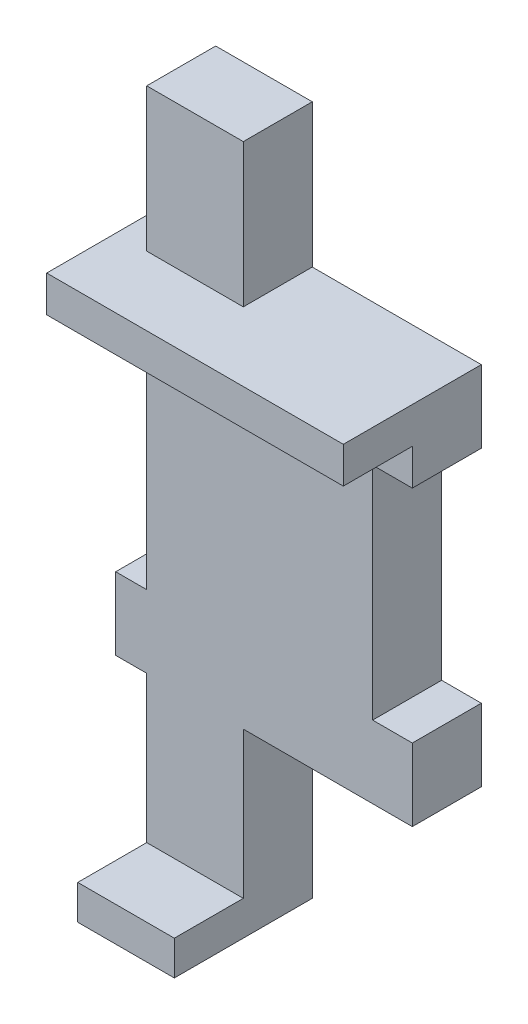
ISO-10303-21;
HEADER;
FILE_DESCRIPTION(('STEP AP214'),'2;1');
FILE_NAME('part.step','',(''),(''),'','','');
FILE_SCHEMA(('AUTOMOTIVE_DESIGN { 1 0 10303 214 1 1 1 1 }'));
ENDSEC;
DATA;
#1=APPLICATION_CONTEXT('core data for automotive mechanical design processes');
#2=APPLICATION_PROTOCOL_DEFINITION('international standard','automotive_design',2000,#1);
#3=PRODUCT_CONTEXT('',#1,'mechanical');
#4=PRODUCT('Part','Part','',(#3));
#5=PRODUCT_RELATED_PRODUCT_CATEGORY('part','',(#4));
#6=PRODUCT_DEFINITION_FORMATION('','',#4);
#7=PRODUCT_DEFINITION_CONTEXT('part definition',#1,'design');
#8=PRODUCT_DEFINITION('design','',#6,#7);
#9=PRODUCT_DEFINITION_SHAPE('','',#8);
#10=(LENGTH_UNIT() NAMED_UNIT(*) SI_UNIT(.MILLI.,.METRE.));
#11=(NAMED_UNIT(*) PLANE_ANGLE_UNIT() SI_UNIT($,.RADIAN.));
#12=(NAMED_UNIT(*) SI_UNIT($,.STERADIAN.) SOLID_ANGLE_UNIT());
#13=UNCERTAINTY_MEASURE_WITH_UNIT(LENGTH_MEASURE(1.E-05),#10,'distance_accuracy_value','');
#14=(GEOMETRIC_REPRESENTATION_CONTEXT(3) GLOBAL_UNCERTAINTY_ASSIGNED_CONTEXT((#13)) GLOBAL_UNIT_ASSIGNED_CONTEXT((#10,
#11,#12)) REPRESENTATION_CONTEXT('',''));
#15=CARTESIAN_POINT('',(0.,0.,0.));
#16=DIRECTION('',(0.,0.,1.));
#17=DIRECTION('',(1.,0.,0.));
#18=AXIS2_PLACEMENT_3D('',#15,#16,#17);
#19=CARTESIAN_POINT('',(0.,0.,4.));
#20=DIRECTION('',(0.,0.,1.));
#21=DIRECTION('',(1.,0.,0.));
#22=AXIS2_PLACEMENT_3D('',#19,#20,#21);
#23=PLANE('',#22);
#24=DIRECTION('',(0.,-1.,0.));
#25=VECTOR('',#24,1.);
#26=CARTESIAN_POINT('',(12.6,11.7,4.));
#27=LINE('',#26,#25);
#28=CARTESIAN_POINT('',(12.6,9.6,4.));
#29=VERTEX_POINT('',#28);
#30=CARTESIAN_POINT('',(12.6,7.5,4.));
#31=VERTEX_POINT('',#30);
#32=EDGE_CURVE('E432',#29,#31,#27,.T.);
#33=ORIENTED_EDGE('',*,*,#32,.F.);
#34=DIRECTION('',(1.,0.,0.));
#35=VECTOR('',#34,1.);
#36=CARTESIAN_POINT('',(-4.6,9.6,4.));
#37=LINE('',#36,#35);
#38=CARTESIAN_POINT('',(-4.6,9.6,4.));
#39=VERTEX_POINT('',#38);
#40=EDGE_CURVE('E521',#39,#29,#37,.T.);
#41=ORIENTED_EDGE('',*,*,#40,.F.);
#42=DIRECTION('',(0.,1.,0.));
#43=VECTOR('',#42,1.);
#44=CARTESIAN_POINT('',(-4.6,11.7,4.));
#45=LINE('',#44,#43);
#46=CARTESIAN_POINT('',(-4.6,7.5,4.));
#47=VERTEX_POINT('',#46);
#48=EDGE_CURVE('E298',#47,#39,#45,.T.);
#49=ORIENTED_EDGE('',*,*,#48,.F.);
#50=DIRECTION('',(1.,0.,0.));
#51=VECTOR('',#50,1.);
#52=CARTESIAN_POINT('',(-4.6,7.5,4.));
#53=LINE('',#52,#51);
#54=CARTESIAN_POINT('',(-2.8,7.5,4.));
#55=VERTEX_POINT('',#54);
#56=EDGE_CURVE('E315',#47,#55,#53,.T.);
#57=ORIENTED_EDGE('',*,*,#56,.T.);
#58=DIRECTION('',(0.,1.,0.));
#59=VECTOR('',#58,1.);
#60=CARTESIAN_POINT('',(-2.8,-20.,4.));
#61=LINE('',#60,#59);
#62=CARTESIAN_POINT('',(-2.8,-5.3,4.));
#63=VERTEX_POINT('',#62);
#64=EDGE_CURVE('E365',#63,#55,#61,.T.);
#65=ORIENTED_EDGE('',*,*,#64,.F.);
#66=DIRECTION('',(1.,0.,0.));
#67=VECTOR('',#66,1.);
#68=CARTESIAN_POINT('',(-4.6,-5.3,4.));
#69=LINE('',#68,#67);
#70=CARTESIAN_POINT('',(-4.6,-5.3,4.));
#71=VERTEX_POINT('',#70);
#72=EDGE_CURVE('E267',#71,#63,#69,.T.);
#73=ORIENTED_EDGE('',*,*,#72,.F.);
#74=DIRECTION('',(0.,-1.,0.));
#75=VECTOR('',#74,1.);
#76=CARTESIAN_POINT('',(-4.6,-9.5,4.));
#77=LINE('',#76,#75);
#78=CARTESIAN_POINT('',(-4.6,-9.5,4.));
#79=VERTEX_POINT('',#78);
#80=EDGE_CURVE('E252',#71,#79,#77,.T.);
#81=ORIENTED_EDGE('',*,*,#80,.T.);
#82=DIRECTION('',(1.,0.,0.));
#83=VECTOR('',#82,1.);
#84=CARTESIAN_POINT('',(-4.6,-9.5,4.));
#85=LINE('',#84,#83);
#86=CARTESIAN_POINT('',(-2.8,-9.5,4.));
#87=VERTEX_POINT('',#86);
#88=EDGE_CURVE('E270',#79,#87,#85,.T.);
#89=ORIENTED_EDGE('',*,*,#88,.T.);
#90=CARTESIAN_POINT('',(-2.8,-18.,4.));
#91=VERTEX_POINT('',#90);
#92=EDGE_CURVE('E360',#91,#87,#61,.T.);
#93=ORIENTED_EDGE('',*,*,#92,.F.);
#94=DIRECTION('',(-1.,0.,0.));
#95=VECTOR('',#94,1.);
#96=CARTESIAN_POINT('',(-2.8,-18.,4.));
#97=LINE('',#96,#95);
#98=CARTESIAN_POINT('',(2.8,-18.,4.));
#99=VERTEX_POINT('',#98);
#100=EDGE_CURVE('E323',#99,#91,#97,.T.);
#101=ORIENTED_EDGE('',*,*,#100,.F.);
#102=DIRECTION('',(0.,1.,0.));
#103=VECTOR('',#102,1.);
#104=CARTESIAN_POINT('',(2.8,-20.,4.));
#105=LINE('',#104,#103);
#106=CARTESIAN_POINT('',(2.8,-9.5,4.));
#107=VERTEX_POINT('',#106);
#108=EDGE_CURVE('E350',#99,#107,#105,.T.);
#109=ORIENTED_EDGE('',*,*,#108,.T.);
#110=DIRECTION('',(-1.,0.,0.));
#111=VECTOR('',#110,1.);
#112=CARTESIAN_POINT('',(4.6,-9.5,4.));
#113=LINE('',#112,#111);
#114=CARTESIAN_POINT('',(12.6,-9.5,4.));
#115=VERTEX_POINT('',#114);
#116=EDGE_CURVE('E240',#115,#107,#113,.T.);
#117=ORIENTED_EDGE('',*,*,#116,.F.);
#118=DIRECTION('',(0.,-1.,0.));
#119=VECTOR('',#118,1.);
#120=CARTESIAN_POINT('',(12.6,-5.3,4.));
#121=LINE('',#120,#119);
#122=CARTESIAN_POINT('',(12.6,-5.3,4.));
#123=VERTEX_POINT('',#122);
#124=EDGE_CURVE('E446',#123,#115,#121,.T.);
#125=ORIENTED_EDGE('',*,*,#124,.F.);
#126=DIRECTION('',(-1.,0.,0.));
#127=VECTOR('',#126,1.);
#128=CARTESIAN_POINT('',(4.6,-5.3,4.));
#129=LINE('',#128,#127);
#130=CARTESIAN_POINT('',(10.3,-5.3,4.));
#131=VERTEX_POINT('',#130);
#132=EDGE_CURVE('E233',#123,#131,#129,.T.);
#133=ORIENTED_EDGE('',*,*,#132,.T.);
#134=DIRECTION('',(0.,-1.,0.));
#135=VECTOR('',#134,1.);
#136=CARTESIAN_POINT('',(10.3,7.5,4.));
#137=LINE('',#136,#135);
#138=CARTESIAN_POINT('',(10.3,7.5,4.));
#139=VERTEX_POINT('',#138);
#140=EDGE_CURVE('E61',#139,#131,#137,.T.);
#141=ORIENTED_EDGE('',*,*,#140,.F.);
#142=DIRECTION('',(-1.,0.,0.));
#143=VECTOR('',#142,1.);
#144=CARTESIAN_POINT('',(4.6,7.5,4.));
#145=LINE('',#144,#143);
#146=EDGE_CURVE('E282',#31,#139,#145,.T.);
#147=ORIENTED_EDGE('',*,*,#146,.F.);
#148=EDGE_LOOP('',(#33,#41,#49,#57,#65,#73,#81,#89,#93,#101,#109,#117,#125,#133,#141,#147));
#149=FACE_BOUND('',#148,.T.);
#150=ADVANCED_FACE('F45',(#149),#23,.T.);
#151=CARTESIAN_POINT('',(-2.8,11.7,4.));
#152=VERTEX_POINT('',#151);
#153=CARTESIAN_POINT('',(-2.8,20.,4.));
#154=VERTEX_POINT('',#153);
#155=EDGE_CURVE('E359',#152,#154,#61,.T.);
#156=ORIENTED_EDGE('',*,*,#155,.F.);
#157=DIRECTION('',(-1.,0.,0.));
#158=VECTOR('',#157,1.);
#159=CARTESIAN_POINT('',(-4.6,11.7,4.));
#160=LINE('',#159,#158);
#161=CARTESIAN_POINT('',(2.8,11.7,4.));
#162=VERTEX_POINT('',#161);
#163=EDGE_CURVE('E408',#162,#152,#160,.T.);
#164=ORIENTED_EDGE('',*,*,#163,.F.);
#165=CARTESIAN_POINT('',(2.8,20.,4.));
#166=VERTEX_POINT('',#165);
#167=EDGE_CURVE('E355',#162,#166,#105,.T.);
#168=ORIENTED_EDGE('',*,*,#167,.T.);
#169=DIRECTION('',(1.,0.,0.));
#170=VECTOR('',#169,1.);
#171=CARTESIAN_POINT('',(-2.8,20.,4.));
#172=LINE('',#171,#170);
#173=EDGE_CURVE('E354',#154,#166,#172,.T.);
#174=ORIENTED_EDGE('',*,*,#173,.F.);
#175=EDGE_LOOP('',(#156,#164,#168,#174));
#176=FACE_BOUND('',#175,.T.);
#177=ADVANCED_FACE('F407',(#176),#23,.T.);
#178=CARTESIAN_POINT('',(2.8,-20.,4.));
#179=DIRECTION('',(-1.,0.,0.));
#180=DIRECTION('',(0.,0.,1.));
#181=AXIS2_PLACEMENT_3D('',#178,#179,#180);
#182=PLANE('',#181);
#183=DIRECTION('',(0.,0.,-1.));
#184=VECTOR('',#183,1.);
#185=CARTESIAN_POINT('',(2.8,-9.5,0.));
#186=LINE('',#185,#184);
#187=CARTESIAN_POINT('',(2.8,-9.5,0.));
#188=VERTEX_POINT('',#187);
#189=EDGE_CURVE('E430',#107,#188,#186,.T.);
#190=ORIENTED_EDGE('',*,*,#189,.F.);
#191=ORIENTED_EDGE('',*,*,#108,.F.);
#192=DIRECTION('',(0.,0.,-1.));
#193=VECTOR('',#192,1.);
#194=CARTESIAN_POINT('',(2.8,-18.,8.));
#195=LINE('',#194,#193);
#196=CARTESIAN_POINT('',(2.8,-18.,8.));
#197=VERTEX_POINT('',#196);
#198=EDGE_CURVE('E345',#197,#99,#195,.T.);
#199=ORIENTED_EDGE('',*,*,#198,.F.);
#200=DIRECTION('',(0.,1.,0.));
#201=VECTOR('',#200,1.);
#202=CARTESIAN_POINT('',(2.8,-20.,8.));
#203=LINE('',#202,#201);
#204=CARTESIAN_POINT('',(2.8,-20.,8.));
#205=VERTEX_POINT('',#204);
#206=EDGE_CURVE('E332',#205,#197,#203,.T.);
#207=ORIENTED_EDGE('',*,*,#206,.F.);
#208=DIRECTION('',(0.,0.,-1.));
#209=VECTOR('',#208,1.);
#210=CARTESIAN_POINT('',(2.8,-20.,4.));
#211=LINE('',#210,#209);
#212=CARTESIAN_POINT('',(2.8,-20.,0.));
#213=VERTEX_POINT('',#212);
#214=EDGE_CURVE('E11',#205,#213,#211,.T.);
#215=ORIENTED_EDGE('',*,*,#214,.T.);
#216=DIRECTION('',(0.,1.,0.));
#217=VECTOR('',#216,1.);
#218=CARTESIAN_POINT('',(2.8,-20.,0.));
#219=LINE('',#218,#217);
#220=EDGE_CURVE('E370',#213,#188,#219,.T.);
#221=ORIENTED_EDGE('',*,*,#220,.T.);
#222=EDGE_LOOP('',(#190,#191,#199,#207,#215,#221));
#223=FACE_BOUND('',#222,.T.);
#224=ADVANCED_FACE('F467',(#223),#182,.F.);
#225=CARTESIAN_POINT('',(-2.8,-20.,4.));
#226=DIRECTION('',(-1.,0.,0.));
#227=DIRECTION('',(0.,0.,1.));
#228=AXIS2_PLACEMENT_3D('',#225,#226,#227);
#229=PLANE('',#228);
#230=DIRECTION('',(0.,0.,-1.));
#231=VECTOR('',#230,1.);
#232=CARTESIAN_POINT('',(-2.8,-9.5,0.));
#233=LINE('',#232,#231);
#234=CARTESIAN_POINT('',(-2.8,-9.5,0.));
#235=VERTEX_POINT('',#234);
#236=EDGE_CURVE('E232',#87,#235,#233,.T.);
#237=ORIENTED_EDGE('',*,*,#236,.T.);
#238=DIRECTION('',(0.,1.,0.));
#239=VECTOR('',#238,1.);
#240=CARTESIAN_POINT('',(-2.8,-20.,0.));
#241=LINE('',#240,#239);
#242=CARTESIAN_POINT('',(-2.8,-20.,0.));
#243=VERTEX_POINT('',#242);
#244=EDGE_CURVE('E378',#243,#235,#241,.T.);
#245=ORIENTED_EDGE('',*,*,#244,.F.);
#246=DIRECTION('',(0.,0.,-1.));
#247=VECTOR('',#246,1.);
#248=CARTESIAN_POINT('',(-2.8,-20.,4.));
#249=LINE('',#248,#247);
#250=CARTESIAN_POINT('',(-2.8,-20.,8.));
#251=VERTEX_POINT('',#250);
#252=EDGE_CURVE('E364',#251,#243,#249,.T.);
#253=ORIENTED_EDGE('',*,*,#252,.F.);
#254=DIRECTION('',(0.,-1.,0.));
#255=VECTOR('',#254,1.);
#256=CARTESIAN_POINT('',(-2.8,-20.,8.));
#257=LINE('',#256,#255);
#258=CARTESIAN_POINT('',(-2.8,-18.,8.));
#259=VERTEX_POINT('',#258);
#260=EDGE_CURVE('E324',#259,#251,#257,.T.);
#261=ORIENTED_EDGE('',*,*,#260,.F.);
#262=DIRECTION('',(0.,0.,-1.));
#263=VECTOR('',#262,1.);
#264=CARTESIAN_POINT('',(-2.8,-18.,8.));
#265=LINE('',#264,#263);
#266=EDGE_CURVE('E338',#259,#91,#265,.T.);
#267=ORIENTED_EDGE('',*,*,#266,.T.);
#268=ORIENTED_EDGE('',*,*,#92,.T.);
#269=EDGE_LOOP('',(#237,#245,#253,#261,#267,#268));
#270=FACE_BOUND('',#269,.T.);
#271=ADVANCED_FACE('F480',(#270),#229,.T.);
#272=DIRECTION('',(0.,0.,-1.));
#273=VECTOR('',#272,1.);
#274=CARTESIAN_POINT('',(-2.8,11.7,0.));
#275=LINE('',#274,#273);
#276=CARTESIAN_POINT('',(-2.8,11.7,0.));
#277=VERTEX_POINT('',#276);
#278=EDGE_CURVE('E295',#152,#277,#275,.T.);
#279=ORIENTED_EDGE('',*,*,#278,.F.);
#280=ORIENTED_EDGE('',*,*,#155,.T.);
#281=DIRECTION('',(0.,0.,-1.));
#282=VECTOR('',#281,1.);
#283=CARTESIAN_POINT('',(-2.8,20.,4.));
#284=LINE('',#283,#282);
#285=CARTESIAN_POINT('',(-2.8,20.,0.));
#286=VERTEX_POINT('',#285);
#287=EDGE_CURVE('E385',#154,#286,#284,.T.);
#288=ORIENTED_EDGE('',*,*,#287,.T.);
#289=EDGE_CURVE('E377',#277,#286,#241,.T.);
#290=ORIENTED_EDGE('',*,*,#289,.F.);
#291=EDGE_LOOP('',(#279,#280,#288,#290));
#292=FACE_BOUND('',#291,.T.);
#293=ADVANCED_FACE('F404',(#292),#229,.T.);
#294=CARTESIAN_POINT('',(-2.8,-20.,4.));
#295=DIRECTION('',(0.,1.,0.));
#296=DIRECTION('',(0.,0.,1.));
#297=AXIS2_PLACEMENT_3D('',#294,#295,#296);
#298=PLANE('',#297);
#299=DIRECTION('',(1.,0.,0.));
#300=VECTOR('',#299,1.);
#301=CARTESIAN_POINT('',(-2.8,-20.,0.));
#302=LINE('',#301,#300);
#303=EDGE_CURVE('E349',#243,#213,#302,.T.);
#304=ORIENTED_EDGE('',*,*,#303,.T.);
#305=ORIENTED_EDGE('',*,*,#214,.F.);
#306=DIRECTION('',(1.,0.,0.));
#307=VECTOR('',#306,1.);
#308=CARTESIAN_POINT('',(-2.8,-20.,8.));
#309=LINE('',#308,#307);
#310=EDGE_CURVE('E328',#251,#205,#309,.T.);
#311=ORIENTED_EDGE('',*,*,#310,.F.);
#312=ORIENTED_EDGE('',*,*,#252,.T.);
#313=EDGE_LOOP('',(#304,#305,#311,#312));
#314=FACE_BOUND('',#313,.T.);
#315=ADVANCED_FACE('F47',(#314),#298,.F.);
#316=ORIENTED_EDGE('',*,*,#167,.F.);
#317=DIRECTION('',(0.,0.,-1.));
#318=VECTOR('',#317,1.);
#319=CARTESIAN_POINT('',(2.8,11.7,0.));
#320=LINE('',#319,#318);
#321=CARTESIAN_POINT('',(2.8,11.7,0.));
#322=VERTEX_POINT('',#321);
#323=EDGE_CURVE('E276',#162,#322,#320,.T.);
#324=ORIENTED_EDGE('',*,*,#323,.T.);
#325=CARTESIAN_POINT('',(2.8,20.,0.));
#326=VERTEX_POINT('',#325);
#327=EDGE_CURVE('E369',#322,#326,#219,.T.);
#328=ORIENTED_EDGE('',*,*,#327,.T.);
#329=DIRECTION('',(0.,0.,-1.));
#330=VECTOR('',#329,1.);
#331=CARTESIAN_POINT('',(2.8,20.,4.));
#332=LINE('',#331,#330);
#333=EDGE_CURVE('E54',#166,#326,#332,.T.);
#334=ORIENTED_EDGE('',*,*,#333,.F.);
#335=EDGE_LOOP('',(#316,#324,#328,#334));
#336=FACE_BOUND('',#335,.T.);
#337=ADVANCED_FACE('F413',(#336),#182,.F.);
#338=CARTESIAN_POINT('',(-2.8,20.,4.));
#339=DIRECTION('',(0.,1.,0.));
#340=DIRECTION('',(0.,0.,1.));
#341=AXIS2_PLACEMENT_3D('',#338,#339,#340);
#342=PLANE('',#341);
#343=DIRECTION('',(1.,0.,0.));
#344=VECTOR('',#343,1.);
#345=CARTESIAN_POINT('',(-2.8,20.,0.));
#346=LINE('',#345,#344);
#347=EDGE_CURVE('E373',#286,#326,#346,.T.);
#348=ORIENTED_EDGE('',*,*,#347,.F.);
#349=ORIENTED_EDGE('',*,*,#287,.F.);
#350=ORIENTED_EDGE('',*,*,#173,.T.);
#351=ORIENTED_EDGE('',*,*,#333,.T.);
#352=EDGE_LOOP('',(#348,#349,#350,#351));
#353=FACE_BOUND('',#352,.T.);
#354=ADVANCED_FACE('F393',(#353),#342,.T.);
#355=DIRECTION('',(0.,0.,1.));
#356=VECTOR('',#355,1.);
#357=CARTESIAN_POINT('',(-2.8,-5.3,0.));
#358=LINE('',#357,#356);
#359=CARTESIAN_POINT('',(-2.8,-5.3,0.));
#360=VERTEX_POINT('',#359);
#361=EDGE_CURVE('E238',#360,#63,#358,.T.);
#362=ORIENTED_EDGE('',*,*,#361,.T.);
#363=ORIENTED_EDGE('',*,*,#64,.T.);
#364=DIRECTION('',(0.,0.,1.));
#365=VECTOR('',#364,1.);
#366=CARTESIAN_POINT('',(-2.8,7.5,0.));
#367=LINE('',#366,#365);
#368=CARTESIAN_POINT('',(-2.8,7.5,0.));
#369=VERTEX_POINT('',#368);
#370=EDGE_CURVE('E289',#369,#55,#367,.T.);
#371=ORIENTED_EDGE('',*,*,#370,.F.);
#372=EDGE_CURVE('E382',#360,#369,#241,.T.);
#373=ORIENTED_EDGE('',*,*,#372,.F.);
#374=EDGE_LOOP('',(#362,#363,#371,#373));
#375=FACE_BOUND('',#374,.T.);
#376=ADVANCED_FACE('F496',(#375),#229,.T.);
#377=CARTESIAN_POINT('',(0.,0.,0.));
#378=DIRECTION('',(0.,0.,1.));
#379=DIRECTION('',(1.,0.,0.));
#380=AXIS2_PLACEMENT_3D('',#377,#378,#379);
#381=PLANE('',#380);
#382=CARTESIAN_POINT('',(4.9,1.1,0.));
#383=DIRECTION('',(0.,0.,-1.));
#384=DIRECTION('',(-1.,0.,0.));
#385=AXIS2_PLACEMENT_3D('',#382,#383,#384);
#386=CIRCLE('',#385,1.5);
#387=CARTESIAN_POINT('',(3.4,1.1,0.));
#388=VERTEX_POINT('',#387);
#389=EDGE_CURVE('E767',#388,#388,#386,.T.);
#390=ORIENTED_EDGE('',*,*,#389,.F.);
#391=EDGE_LOOP('',(#390));
#392=FACE_BOUND('',#391,.T.);
#393=ORIENTED_EDGE('',*,*,#303,.F.);
#394=ORIENTED_EDGE('',*,*,#244,.T.);
#395=DIRECTION('',(1.,0.,0.));
#396=VECTOR('',#395,1.);
#397=CARTESIAN_POINT('',(-4.6,-9.5,0.));
#398=LINE('',#397,#396);
#399=CARTESIAN_POINT('',(-4.6,-9.5,0.));
#400=VERTEX_POINT('',#399);
#401=EDGE_CURVE('E273',#400,#235,#398,.T.);
#402=ORIENTED_EDGE('',*,*,#401,.F.);
#403=DIRECTION('',(0.,1.,0.));
#404=VECTOR('',#403,1.);
#405=CARTESIAN_POINT('',(-4.6,-9.5,0.));
#406=LINE('',#405,#404);
#407=CARTESIAN_POINT('',(-4.6,-5.3,0.));
#408=VERTEX_POINT('',#407);
#409=EDGE_CURVE('E244',#400,#408,#406,.T.);
#410=ORIENTED_EDGE('',*,*,#409,.T.);
#411=DIRECTION('',(1.,0.,0.));
#412=VECTOR('',#411,1.);
#413=CARTESIAN_POINT('',(-4.6,-5.3,0.));
#414=LINE('',#413,#412);
#415=EDGE_CURVE('E259',#408,#360,#414,.T.);
#416=ORIENTED_EDGE('',*,*,#415,.T.);
#417=ORIENTED_EDGE('',*,*,#372,.T.);
#418=DIRECTION('',(1.,0.,0.));
#419=VECTOR('',#418,1.);
#420=CARTESIAN_POINT('',(-4.6,7.5,0.));
#421=LINE('',#420,#419);
#422=CARTESIAN_POINT('',(-4.6,7.5,0.));
#423=VERTEX_POINT('',#422);
#424=EDGE_CURVE('E319',#423,#369,#421,.T.);
#425=ORIENTED_EDGE('',*,*,#424,.F.);
#426=DIRECTION('',(0.,-1.,0.));
#427=VECTOR('',#426,1.);
#428=CARTESIAN_POINT('',(-4.6,11.7,0.));
#429=LINE('',#428,#427);
#430=CARTESIAN_POINT('',(-4.6,11.7,0.));
#431=VERTEX_POINT('',#430);
#432=EDGE_CURVE('E290',#431,#423,#429,.T.);
#433=ORIENTED_EDGE('',*,*,#432,.F.);
#434=DIRECTION('',(1.,0.,0.));
#435=VECTOR('',#434,1.);
#436=CARTESIAN_POINT('',(-4.6,11.7,0.));
#437=LINE('',#436,#435);
#438=EDGE_CURVE('E305',#431,#277,#437,.T.);
#439=ORIENTED_EDGE('',*,*,#438,.T.);
#440=ORIENTED_EDGE('',*,*,#289,.T.);
#441=ORIENTED_EDGE('',*,*,#347,.T.);
#442=ORIENTED_EDGE('',*,*,#327,.F.);
#443=DIRECTION('',(-1.,0.,0.));
#444=VECTOR('',#443,1.);
#445=CARTESIAN_POINT('',(4.6,11.7,0.));
#446=LINE('',#445,#444);
#447=CARTESIAN_POINT('',(12.6,11.7,0.));
#448=VERTEX_POINT('',#447);
#449=EDGE_CURVE('E286',#448,#322,#446,.T.);
#450=ORIENTED_EDGE('',*,*,#449,.F.);
#451=DIRECTION('',(0.,1.,0.));
#452=VECTOR('',#451,1.);
#453=CARTESIAN_POINT('',(12.6,11.7,0.));
#454=LINE('',#453,#452);
#455=CARTESIAN_POINT('',(12.6,7.5,0.));
#456=VERTEX_POINT('',#455);
#457=EDGE_CURVE('E420',#456,#448,#454,.T.);
#458=ORIENTED_EDGE('',*,*,#457,.F.);
#459=DIRECTION('',(-1.,0.,0.));
#460=VECTOR('',#459,1.);
#461=CARTESIAN_POINT('',(4.6,7.5,0.));
#462=LINE('',#461,#460);
#463=CARTESIAN_POINT('',(10.3,7.5,0.));
#464=VERTEX_POINT('',#463);
#465=EDGE_CURVE('E223',#456,#464,#462,.T.);
#466=ORIENTED_EDGE('',*,*,#465,.T.);
#467=DIRECTION('',(0.,1.,0.));
#468=VECTOR('',#467,1.);
#469=CARTESIAN_POINT('',(10.3,7.5,0.));
#470=LINE('',#469,#468);
#471=CARTESIAN_POINT('',(10.3,-5.3,0.));
#472=VERTEX_POINT('',#471);
#473=EDGE_CURVE('E208',#472,#464,#470,.T.);
#474=ORIENTED_EDGE('',*,*,#473,.F.);
#475=DIRECTION('',(-1.,0.,0.));
#476=VECTOR('',#475,1.);
#477=CARTESIAN_POINT('',(4.6,-5.3,0.));
#478=LINE('',#477,#476);
#479=CARTESIAN_POINT('',(12.6,-5.3,0.));
#480=VERTEX_POINT('',#479);
#481=EDGE_CURVE('E220',#480,#472,#478,.T.);
#482=ORIENTED_EDGE('',*,*,#481,.F.);
#483=DIRECTION('',(0.,1.,0.));
#484=VECTOR('',#483,1.);
#485=CARTESIAN_POINT('',(12.6,-5.3,0.));
#486=LINE('',#485,#484);
#487=CARTESIAN_POINT('',(12.6,-9.5,0.));
#488=VERTEX_POINT('',#487);
#489=EDGE_CURVE('E438',#488,#480,#486,.T.);
#490=ORIENTED_EDGE('',*,*,#489,.F.);
#491=DIRECTION('',(-1.,0.,0.));
#492=VECTOR('',#491,1.);
#493=CARTESIAN_POINT('',(4.6,-9.5,0.));
#494=LINE('',#493,#492);
#495=EDGE_CURVE('E453',#488,#188,#494,.T.);
#496=ORIENTED_EDGE('',*,*,#495,.T.);
#497=ORIENTED_EDGE('',*,*,#220,.F.);
#498=EDGE_LOOP('',(#393,#394,#402,#410,#416,#417,#425,#433,#439,#440,#441,#442,#450,#458,#466,
#474,#482,#490,#496,#497));
#499=FACE_BOUND('',#498,.T.);
#500=ADVANCED_FACE('F218',(#392,#499),#381,.F.);
#501=CARTESIAN_POINT('',(-2.8,-18.,8.));
#502=DIRECTION('',(0.,-1.,0.));
#503=DIRECTION('',(0.,0.,-1.));
#504=AXIS2_PLACEMENT_3D('',#501,#502,#503);
#505=PLANE('',#504);
#506=ORIENTED_EDGE('',*,*,#100,.T.);
#507=ORIENTED_EDGE('',*,*,#266,.F.);
#508=DIRECTION('',(-1.,0.,0.));
#509=VECTOR('',#508,1.);
#510=CARTESIAN_POINT('',(-2.8,-18.,8.));
#511=LINE('',#510,#509);
#512=EDGE_CURVE('E335',#197,#259,#511,.T.);
#513=ORIENTED_EDGE('',*,*,#512,.F.);
#514=ORIENTED_EDGE('',*,*,#198,.T.);
#515=EDGE_LOOP('',(#506,#507,#513,#514));
#516=FACE_BOUND('',#515,.T.);
#517=ADVANCED_FACE('F471',(#516),#505,.F.);
#518=CARTESIAN_POINT('',(0.,0.,8.));
#519=DIRECTION('',(0.,0.,-1.));
#520=DIRECTION('',(-1.,0.,0.));
#521=AXIS2_PLACEMENT_3D('',#518,#519,#520);
#522=PLANE('',#521);
#523=ORIENTED_EDGE('',*,*,#260,.T.);
#524=ORIENTED_EDGE('',*,*,#310,.T.);
#525=ORIENTED_EDGE('',*,*,#206,.T.);
#526=ORIENTED_EDGE('',*,*,#512,.T.);
#527=EDGE_LOOP('',(#523,#524,#525,#526));
#528=FACE_BOUND('',#527,.T.);
#529=ADVANCED_FACE('F475',(#528),#522,.F.);
#530=CARTESIAN_POINT('',(-4.6,7.5,0.));
#531=DIRECTION('',(0.,1.,0.));
#532=DIRECTION('',(0.,0.,1.));
#533=AXIS2_PLACEMENT_3D('',#530,#531,#532);
#534=PLANE('',#533);
#535=ORIENTED_EDGE('',*,*,#370,.T.);
#536=ORIENTED_EDGE('',*,*,#56,.F.);
#537=DIRECTION('',(0.,0.,1.));
#538=VECTOR('',#537,1.);
#539=CARTESIAN_POINT('',(-4.6,7.5,0.));
#540=LINE('',#539,#538);
#541=EDGE_CURVE('E294',#423,#47,#540,.T.);
#542=ORIENTED_EDGE('',*,*,#541,.F.);
#543=ORIENTED_EDGE('',*,*,#424,.T.);
#544=EDGE_LOOP('',(#535,#536,#542,#543));
#545=FACE_BOUND('',#544,.T.);
#546=ADVANCED_FACE('F500',(#545),#534,.F.);
#547=CARTESIAN_POINT('',(-4.6,11.7,0.));
#548=DIRECTION('',(0.,-1.,0.));
#549=DIRECTION('',(0.,0.,-1.));
#550=AXIS2_PLACEMENT_3D('',#547,#548,#549);
#551=PLANE('',#550);
#552=ORIENTED_EDGE('',*,*,#278,.T.);
#553=ORIENTED_EDGE('',*,*,#438,.F.);
#554=DIRECTION('',(0.,0.,-1.));
#555=VECTOR('',#554,1.);
#556=CARTESIAN_POINT('',(-4.6,11.7,0.));
#557=LINE('',#556,#555);
#558=CARTESIAN_POINT('',(-4.6,11.7,8.));
#559=VERTEX_POINT('',#558);
#560=EDGE_CURVE('E302',#559,#431,#557,.T.);
#561=ORIENTED_EDGE('',*,*,#560,.F.);
#562=DIRECTION('',(-1.,0.,0.));
#563=VECTOR('',#562,1.);
#564=CARTESIAN_POINT('',(-4.6,11.7,8.));
#565=LINE('',#564,#563);
#566=CARTESIAN_POINT('',(12.6,11.7,8.));
#567=VERTEX_POINT('',#566);
#568=EDGE_CURVE('E508',#567,#559,#565,.T.);
#569=ORIENTED_EDGE('',*,*,#568,.F.);
#570=DIRECTION('',(0.,0.,1.));
#571=VECTOR('',#570,1.);
#572=CARTESIAN_POINT('',(12.6,11.7,4.));
#573=LINE('',#572,#571);
#574=EDGE_CURVE('E418',#448,#567,#573,.T.);
#575=ORIENTED_EDGE('',*,*,#574,.F.);
#576=ORIENTED_EDGE('',*,*,#449,.T.);
#577=ORIENTED_EDGE('',*,*,#323,.F.);
#578=ORIENTED_EDGE('',*,*,#163,.T.);
#579=EDGE_LOOP('',(#552,#553,#561,#569,#575,#576,#577,#578));
#580=FACE_BOUND('',#579,.T.);
#581=ADVANCED_FACE('F415',(#580),#551,.F.);
#582=CARTESIAN_POINT('',(-4.6,0.,0.));
#583=DIRECTION('',(-1.,0.,0.));
#584=DIRECTION('',(0.,0.,1.));
#585=AXIS2_PLACEMENT_3D('',#582,#583,#584);
#586=PLANE('',#585);
#587=ORIENTED_EDGE('',*,*,#432,.T.);
#588=ORIENTED_EDGE('',*,*,#541,.T.);
#589=ORIENTED_EDGE('',*,*,#48,.T.);
#590=DIRECTION('',(0.,0.,-1.));
#591=VECTOR('',#590,1.);
#592=CARTESIAN_POINT('',(-4.6,9.6,8.));
#593=LINE('',#592,#591);
#594=CARTESIAN_POINT('',(-4.6,9.6,8.));
#595=VERTEX_POINT('',#594);
#596=EDGE_CURVE('E439',#595,#39,#593,.T.);
#597=ORIENTED_EDGE('',*,*,#596,.F.);
#598=DIRECTION('',(0.,-1.,0.));
#599=VECTOR('',#598,1.);
#600=CARTESIAN_POINT('',(-4.6,11.7,8.));
#601=LINE('',#600,#599);
#602=EDGE_CURVE('E506',#559,#595,#601,.T.);
#603=ORIENTED_EDGE('',*,*,#602,.F.);
#604=ORIENTED_EDGE('',*,*,#560,.T.);
#605=EDGE_LOOP('',(#587,#588,#589,#597,#603,#604));
#606=FACE_BOUND('',#605,.T.);
#607=ADVANCED_FACE('F502',(#606),#586,.T.);
#608=CARTESIAN_POINT('',(4.6,7.5,0.));
#609=DIRECTION('',(0.,-1.,0.));
#610=DIRECTION('',(0.,0.,-1.));
#611=AXIS2_PLACEMENT_3D('',#608,#609,#610);
#612=PLANE('',#611);
#613=DIRECTION('',(0.,0.,1.));
#614=VECTOR('',#613,1.);
#615=CARTESIAN_POINT('',(10.3,7.5,4.));
#616=LINE('',#615,#614);
#617=EDGE_CURVE('E225',#464,#139,#616,.T.);
#618=ORIENTED_EDGE('',*,*,#617,.F.);
#619=ORIENTED_EDGE('',*,*,#465,.F.);
#620=DIRECTION('',(0.,0.,-1.));
#621=VECTOR('',#620,1.);
#622=CARTESIAN_POINT('',(12.6,7.5,4.));
#623=LINE('',#622,#621);
#624=EDGE_CURVE('E425',#31,#456,#623,.T.);
#625=ORIENTED_EDGE('',*,*,#624,.F.);
#626=ORIENTED_EDGE('',*,*,#146,.T.);
#627=EDGE_LOOP('',(#618,#619,#625,#626));
#628=FACE_BOUND('',#627,.T.);
#629=ADVANCED_FACE('F531',(#628),#612,.T.);
#630=CARTESIAN_POINT('',(-4.6,-9.5,0.));
#631=DIRECTION('',(0.,-1.,0.));
#632=DIRECTION('',(0.,0.,-1.));
#633=AXIS2_PLACEMENT_3D('',#630,#631,#632);
#634=PLANE('',#633);
#635=ORIENTED_EDGE('',*,*,#236,.F.);
#636=ORIENTED_EDGE('',*,*,#88,.F.);
#637=DIRECTION('',(0.,0.,-1.));
#638=VECTOR('',#637,1.);
#639=CARTESIAN_POINT('',(-4.6,-9.5,0.));
#640=LINE('',#639,#638);
#641=EDGE_CURVE('E248',#79,#400,#640,.T.);
#642=ORIENTED_EDGE('',*,*,#641,.T.);
#643=ORIENTED_EDGE('',*,*,#401,.T.);
#644=EDGE_LOOP('',(#635,#636,#642,#643));
#645=FACE_BOUND('',#644,.T.);
#646=ADVANCED_FACE('F483',(#645),#634,.T.);
#647=CARTESIAN_POINT('',(-4.6,-5.3,0.));
#648=DIRECTION('',(0.,1.,0.));
#649=DIRECTION('',(0.,0.,1.));
#650=AXIS2_PLACEMENT_3D('',#647,#648,#649);
#651=PLANE('',#650);
#652=ORIENTED_EDGE('',*,*,#361,.F.);
#653=ORIENTED_EDGE('',*,*,#415,.F.);
#654=DIRECTION('',(0.,0.,1.));
#655=VECTOR('',#654,1.);
#656=CARTESIAN_POINT('',(-4.6,-5.3,0.));
#657=LINE('',#656,#655);
#658=EDGE_CURVE('E256',#408,#71,#657,.T.);
#659=ORIENTED_EDGE('',*,*,#658,.T.);
#660=ORIENTED_EDGE('',*,*,#72,.T.);
#661=EDGE_LOOP('',(#652,#653,#659,#660));
#662=FACE_BOUND('',#661,.T.);
#663=ADVANCED_FACE('F491',(#662),#651,.T.);
#664=CARTESIAN_POINT('',(-4.6,2.2,0.));
#665=DIRECTION('',(-1.,0.,0.));
#666=DIRECTION('',(0.,0.,1.));
#667=AXIS2_PLACEMENT_3D('',#664,#665,#666);
#668=PLANE('',#667);
#669=ORIENTED_EDGE('',*,*,#409,.F.);
#670=ORIENTED_EDGE('',*,*,#641,.F.);
#671=ORIENTED_EDGE('',*,*,#80,.F.);
#672=ORIENTED_EDGE('',*,*,#658,.F.);
#673=EDGE_LOOP('',(#669,#670,#671,#672));
#674=FACE_BOUND('',#673,.T.);
#675=ADVANCED_FACE('F488',(#674),#668,.T.);
#676=CARTESIAN_POINT('',(4.6,-5.3,0.));
#677=DIRECTION('',(0.,-1.,0.));
#678=DIRECTION('',(0.,0.,-1.));
#679=AXIS2_PLACEMENT_3D('',#676,#677,#678);
#680=PLANE('',#679);
#681=ORIENTED_EDGE('',*,*,#481,.T.);
#682=DIRECTION('',(0.,0.,-1.));
#683=VECTOR('',#682,1.);
#684=CARTESIAN_POINT('',(10.3,-5.3,4.));
#685=LINE('',#684,#683);
#686=EDGE_CURVE('E205',#131,#472,#685,.T.);
#687=ORIENTED_EDGE('',*,*,#686,.F.);
#688=ORIENTED_EDGE('',*,*,#132,.F.);
#689=DIRECTION('',(0.,0.,1.));
#690=VECTOR('',#689,1.);
#691=CARTESIAN_POINT('',(12.6,-5.3,4.));
#692=LINE('',#691,#690);
#693=EDGE_CURVE('E230',#480,#123,#692,.T.);
#694=ORIENTED_EDGE('',*,*,#693,.F.);
#695=EDGE_LOOP('',(#681,#687,#688,#694));
#696=FACE_BOUND('',#695,.T.);
#697=ADVANCED_FACE('F228',(#696),#680,.F.);
#698=CARTESIAN_POINT('',(4.6,-9.5,0.));
#699=DIRECTION('',(0.,1.,0.));
#700=DIRECTION('',(0.,0.,1.));
#701=AXIS2_PLACEMENT_3D('',#698,#699,#700);
#702=PLANE('',#701);
#703=ORIENTED_EDGE('',*,*,#189,.T.);
#704=ORIENTED_EDGE('',*,*,#495,.F.);
#705=DIRECTION('',(0.,0.,-1.));
#706=VECTOR('',#705,1.);
#707=CARTESIAN_POINT('',(12.6,-9.5,4.));
#708=LINE('',#707,#706);
#709=EDGE_CURVE('E442',#115,#488,#708,.T.);
#710=ORIENTED_EDGE('',*,*,#709,.F.);
#711=ORIENTED_EDGE('',*,*,#116,.T.);
#712=EDGE_LOOP('',(#703,#704,#710,#711));
#713=FACE_BOUND('',#712,.T.);
#714=ADVANCED_FACE('F460',(#713),#702,.F.);
#715=CARTESIAN_POINT('',(12.6,0.,0.));
#716=DIRECTION('',(1.,0.,0.));
#717=DIRECTION('',(0.,0.,-1.));
#718=AXIS2_PLACEMENT_3D('',#715,#716,#717);
#719=PLANE('',#718);
#720=ORIENTED_EDGE('',*,*,#124,.T.);
#721=ORIENTED_EDGE('',*,*,#709,.T.);
#722=ORIENTED_EDGE('',*,*,#489,.T.);
#723=ORIENTED_EDGE('',*,*,#693,.T.);
#724=EDGE_LOOP('',(#720,#721,#722,#723));
#725=FACE_BOUND('',#724,.T.);
#726=ADVANCED_FACE('F549',(#725),#719,.T.);
#727=CARTESIAN_POINT('',(12.6,0.,0.));
#728=DIRECTION('',(1.,0.,0.));
#729=DIRECTION('',(0.,0.,-1.));
#730=AXIS2_PLACEMENT_3D('',#727,#728,#729);
#731=PLANE('',#730);
#732=ORIENTED_EDGE('',*,*,#574,.T.);
#733=DIRECTION('',(0.,1.,0.));
#734=VECTOR('',#733,1.);
#735=CARTESIAN_POINT('',(12.6,11.7,8.));
#736=LINE('',#735,#734);
#737=CARTESIAN_POINT('',(12.6,9.6,8.));
#738=VERTEX_POINT('',#737);
#739=EDGE_CURVE('E511',#738,#567,#736,.T.);
#740=ORIENTED_EDGE('',*,*,#739,.F.);
#741=DIRECTION('',(0.,0.,-1.));
#742=VECTOR('',#741,1.);
#743=CARTESIAN_POINT('',(12.6,9.6,8.));
#744=LINE('',#743,#742);
#745=EDGE_CURVE('E69',#738,#29,#744,.T.);
#746=ORIENTED_EDGE('',*,*,#745,.T.);
#747=ORIENTED_EDGE('',*,*,#32,.T.);
#748=ORIENTED_EDGE('',*,*,#624,.T.);
#749=ORIENTED_EDGE('',*,*,#457,.T.);
#750=EDGE_LOOP('',(#732,#740,#746,#747,#748,#749));
#751=FACE_BOUND('',#750,.T.);
#752=ADVANCED_FACE('F422',(#751),#731,.T.);
#753=CARTESIAN_POINT('',(-4.6,9.6,8.));
#754=DIRECTION('',(0.,1.,0.));
#755=DIRECTION('',(0.,0.,1.));
#756=AXIS2_PLACEMENT_3D('',#753,#754,#755);
#757=PLANE('',#756);
#758=ORIENTED_EDGE('',*,*,#40,.T.);
#759=ORIENTED_EDGE('',*,*,#745,.F.);
#760=DIRECTION('',(1.,0.,0.));
#761=VECTOR('',#760,1.);
#762=CARTESIAN_POINT('',(-4.6,9.6,8.));
#763=LINE('',#762,#761);
#764=EDGE_CURVE('E517',#595,#738,#763,.T.);
#765=ORIENTED_EDGE('',*,*,#764,.F.);
#766=ORIENTED_EDGE('',*,*,#596,.T.);
#767=EDGE_LOOP('',(#758,#759,#765,#766));
#768=FACE_BOUND('',#767,.T.);
#769=ADVANCED_FACE('F538',(#768),#757,.F.);
#770=CARTESIAN_POINT('',(0.,0.,8.));
#771=DIRECTION('',(0.,0.,1.));
#772=DIRECTION('',(1.,0.,0.));
#773=AXIS2_PLACEMENT_3D('',#770,#771,#772);
#774=PLANE('',#773);
#775=ORIENTED_EDGE('',*,*,#602,.T.);
#776=ORIENTED_EDGE('',*,*,#764,.T.);
#777=ORIENTED_EDGE('',*,*,#739,.T.);
#778=ORIENTED_EDGE('',*,*,#568,.T.);
#779=EDGE_LOOP('',(#775,#776,#777,#778));
#780=FACE_BOUND('',#779,.T.);
#781=ADVANCED_FACE('F510',(#780),#774,.T.);
#782=CARTESIAN_POINT('',(10.3,0.,0.));
#783=DIRECTION('',(1.,0.,0.));
#784=DIRECTION('',(0.,0.,-1.));
#785=AXIS2_PLACEMENT_3D('',#782,#783,#784);
#786=PLANE('',#785);
#787=ORIENTED_EDGE('',*,*,#140,.T.);
#788=ORIENTED_EDGE('',*,*,#686,.T.);
#789=ORIENTED_EDGE('',*,*,#473,.T.);
#790=ORIENTED_EDGE('',*,*,#617,.T.);
#791=EDGE_LOOP('',(#787,#788,#789,#790));
#792=FACE_BOUND('',#791,.T.);
#793=ADVANCED_FACE('F207',(#792),#786,.T.);
#794=CARTESIAN_POINT('',(4.9,1.1,1.));
#795=DIRECTION('',(0.,0.,-1.));
#796=DIRECTION('',(-1.,0.,0.));
#797=AXIS2_PLACEMENT_3D('',#794,#795,#796);
#798=CYLINDRICAL_SURFACE('',#797,1.5);
#799=CARTESIAN_POINT('',(4.9,1.1,1.));
#800=DIRECTION('',(0.,0.,-1.));
#801=DIRECTION('',(-1.,0.,0.));
#802=AXIS2_PLACEMENT_3D('',#799,#800,#801);
#803=CIRCLE('',#802,1.5);
#804=CARTESIAN_POINT('',(3.4,1.1,1.));
#805=VERTEX_POINT('',#804);
#806=EDGE_CURVE('E765',#805,#805,#803,.T.);
#807=ORIENTED_EDGE('',*,*,#806,.F.);
#808=EDGE_LOOP('',(#807));
#809=FACE_BOUND('',#808,.T.);
#810=ORIENTED_EDGE('',*,*,#389,.T.);
#811=EDGE_LOOP('',(#810));
#812=FACE_BOUND('',#811,.T.);
#813=ADVANCED_FACE('F741',(#809,#812),#798,.F.);
#814=CARTESIAN_POINT('',(4.9,1.1,1.));
#815=DIRECTION('',(0.,0.,-1.));
#816=DIRECTION('',(-1.,0.,0.));
#817=AXIS2_PLACEMENT_3D('',#814,#815,#816);
#818=PLANE('',#817);
#819=ORIENTED_EDGE('',*,*,#806,.T.);
#820=EDGE_LOOP('',(#819));
#821=FACE_BOUND('',#820,.T.);
#822=ADVANCED_FACE('F750',(#821),#818,.T.);
#823=CLOSED_SHELL('',(#150,#177,#224,#271,#293,#315,#337,#354,#376,#500,#517,#529,#546,#581,
#607,#629,#646,#663,#675,#697,#714,#726,#752,#769,#781,#793,#813,#822));
#824=MANIFOLD_SOLID_BREP('B2',#823);
#825=ADVANCED_BREP_SHAPE_REPRESENTATION('',(#18,#824),#14);
#826=SHAPE_DEFINITION_REPRESENTATION(#9,#825);
ENDSEC;
END-ISO-10303-21;
